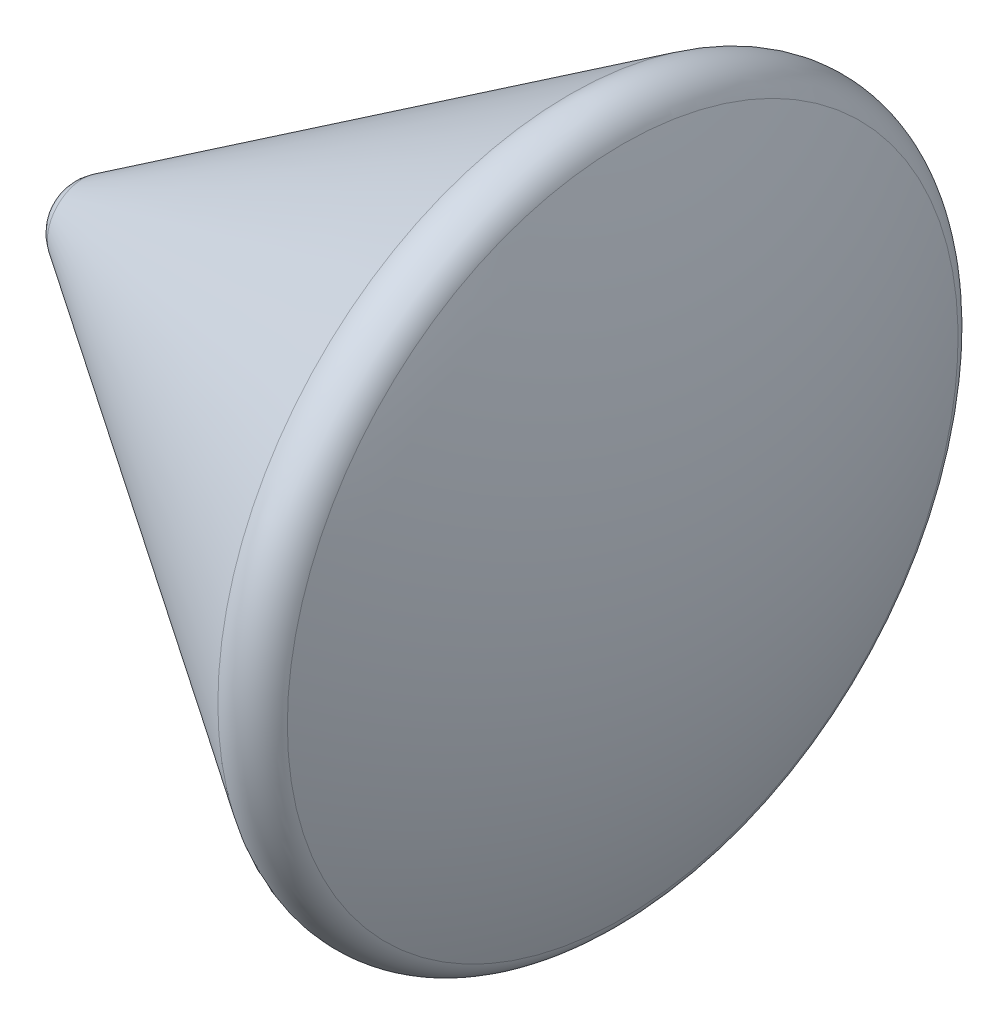
ISO-10303-21;
HEADER;
FILE_DESCRIPTION(('STEP AP214'),'2;1');
FILE_NAME('part.step','',(''),(''),'','','');
FILE_SCHEMA(('AUTOMOTIVE_DESIGN { 1 0 10303 214 1 1 1 1 }'));
ENDSEC;
DATA;
#1=APPLICATION_CONTEXT('core data for automotive mechanical design processes');
#2=APPLICATION_PROTOCOL_DEFINITION('international standard','automotive_design',2000,#1);
#3=PRODUCT_CONTEXT('',#1,'mechanical');
#4=PRODUCT('Part','Part','',(#3));
#5=PRODUCT_RELATED_PRODUCT_CATEGORY('part','',(#4));
#6=PRODUCT_DEFINITION_FORMATION('','',#4);
#7=PRODUCT_DEFINITION_CONTEXT('part definition',#1,'design');
#8=PRODUCT_DEFINITION('design','',#6,#7);
#9=PRODUCT_DEFINITION_SHAPE('','',#8);
#10=(LENGTH_UNIT() NAMED_UNIT(*) SI_UNIT(.MILLI.,.METRE.));
#11=(NAMED_UNIT(*) PLANE_ANGLE_UNIT() SI_UNIT($,.RADIAN.));
#12=(NAMED_UNIT(*) SI_UNIT($,.STERADIAN.) SOLID_ANGLE_UNIT());
#13=UNCERTAINTY_MEASURE_WITH_UNIT(LENGTH_MEASURE(1.E-05),#10,'distance_accuracy_value','');
#14=(GEOMETRIC_REPRESENTATION_CONTEXT(3) GLOBAL_UNCERTAINTY_ASSIGNED_CONTEXT((#13)) GLOBAL_UNIT_ASSIGNED_CONTEXT((#10,
#11,#12)) REPRESENTATION_CONTEXT('',''));
#15=CARTESIAN_POINT('',(0.,0.,0.));
#16=DIRECTION('',(0.,0.,1.));
#17=DIRECTION('',(1.,0.,0.));
#18=AXIS2_PLACEMENT_3D('',#15,#16,#17);
#19=CARTESIAN_POINT('',(231.,0.,0.));
#20=DIRECTION('',(-1.,0.,0.));
#21=DIRECTION('',(0.,1.,0.));
#22=AXIS2_PLACEMENT_3D('',#19,#20,#21);
#23=SPHERICAL_SURFACE('',#22,231.);
#24=CARTESIAN_POINT('',(105.18838291153,0.,0.));
#25=DIRECTION('',(-1.,0.,0.));
#26=DIRECTION('',(0.,0.,1.));
#27=AXIS2_PLACEMENT_3D('',#24,#25,#26);
#28=CIRCLE('',#27,193.732901195394);
#29=CARTESIAN_POINT('',(105.18838291153,0.,-193.732901195394));
#30=VERTEX_POINT('',#29);
#31=EDGE_CURVE('E45',#30,#30,#28,.T.);
#32=ORIENTED_EDGE('',*,*,#31,.T.);
#33=EDGE_LOOP('',(#32));
#34=FACE_BOUND('',#33,.T.);
#35=ADVANCED_FACE('F35',(#34),#23,.T.);
#36=CARTESIAN_POINT('',(-1303.,0.,0.));
#37=DIRECTION('',(-1.,0.,0.));
#38=DIRECTION('',(0.,1.,0.));
#39=AXIS2_PLACEMENT_3D('',#36,#37,#38);
#40=SPHERICAL_SURFACE('',#39,4694.);
#41=CARTESIAN_POINT('',(3025.84671646712,0.,0.));
#42=DIRECTION('',(-1.,0.,0.));
#43=DIRECTION('',(0.,0.,1.));
#44=AXIS2_PLACEMENT_3D('',#41,#42,#43);
#45=CIRCLE('',#44,1815.1369384517);
#46=CARTESIAN_POINT('',(3025.84671646712,0.,1815.1369384517));
#47=VERTEX_POINT('',#46);
#48=EDGE_CURVE('E10',#47,#47,#45,.T.);
#49=ORIENTED_EDGE('',*,*,#48,.F.);
#50=EDGE_LOOP('',(#49));
#51=FACE_BOUND('',#50,.T.);
#52=ADVANCED_FACE('F60',(#51),#40,.T.);
#53=CARTESIAN_POINT('',(2845.09384973777,0.,0.));
#54=DIRECTION('',(-1.,0.,0.));
#55=DIRECTION('',(0.,0.,1.));
#56=AXIS2_PLACEMENT_3D('',#53,#54,#55);
#57=TOROIDAL_SURFACE('',#56,1739.34511059986,196.);
#58=CARTESIAN_POINT('',(2738.34459887483,0.,0.));
#59=DIRECTION('',(-1.,0.,0.));
#60=DIRECTION('',(0.,0.,1.));
#61=AXIS2_PLACEMENT_3D('',#58,#59,#60);
#62=CIRCLE('',#61,1903.72454191717);
#63=CARTESIAN_POINT('',(2738.34459887483,0.,-1903.72454191717));
#64=VERTEX_POINT('',#63);
#65=EDGE_CURVE('E41',#64,#64,#62,.T.);
#66=ORIENTED_EDGE('',*,*,#65,.F.);
#67=EDGE_LOOP('',(#66));
#68=FACE_BOUND('',#67,.T.);
#69=ORIENTED_EDGE('',*,*,#48,.T.);
#70=EDGE_LOOP('',(#69));
#71=FACE_BOUND('',#70,.T.);
#72=ADVANCED_FACE('F55',(#68,#71),#57,.T.);
#73=CARTESIAN_POINT('',(2738.34459887483,0.,0.));
#74=DIRECTION('',(1.,0.,0.));
#75=DIRECTION('',(0.,0.,-1.));
#76=AXIS2_PLACEMENT_3D('',#73,#74,#75);
#77=CONICAL_SURFACE('',#76,1903.72454191717,0.575958653158123);
#78=CARTESIAN_POINT('',(105.18838291153,0.,-193.732901195394));
#79=CARTESIAN_POINT('',(132.617093494481,0.,-211.545314119579));
#80=CARTESIAN_POINT('',(160.045804077432,0.,-229.357727043764));
#81=CARTESIAN_POINT('',(214.903225243334,0.,-264.982552892134));
#82=CARTESIAN_POINT('',(242.331935826285,0.,-282.794965816319));
#83=CARTESIAN_POINT('',(297.189356992187,0.,-318.41979166469));
#84=CARTESIAN_POINT('',(324.618067575138,0.,-336.232204588875));
#85=CARTESIAN_POINT('',(379.47548874104,0.,-371.857030437245));
#86=CARTESIAN_POINT('',(406.904199323991,0.,-389.66944336143));
#87=CARTESIAN_POINT('',(461.761620489893,0.,-425.2942692098));
#88=CARTESIAN_POINT('',(489.190331072845,0.,-443.106682133985));
#89=CARTESIAN_POINT('',(544.047752238747,0.,-478.731507982356));
#90=CARTESIAN_POINT('',(571.476462821698,0.,-496.543920906541));
#91=CARTESIAN_POINT('',(626.3338839876,0.,-532.168746754911));
#92=CARTESIAN_POINT('',(653.762594570551,0.,-549.981159679096));
#93=CARTESIAN_POINT('',(708.620015736453,0.,-585.605985527467));
#94=CARTESIAN_POINT('',(736.048726319404,0.,-603.418398451652));
#95=CARTESIAN_POINT('',(790.906147485306,0.,-639.043224300022));
#96=CARTESIAN_POINT('',(818.334858068257,0.,-656.855637224207));
#97=CARTESIAN_POINT('',(873.192279234159,0.,-692.480463072577));
#98=CARTESIAN_POINT('',(900.62098981711,0.,-710.292875996762));
#99=CARTESIAN_POINT('',(955.478410983012,0.,-745.917701845132));
#100=CARTESIAN_POINT('',(982.907121565964,0.,-763.730114769318));
#101=CARTESIAN_POINT('',(1037.76454273187,0.,-799.354940617688));
#102=CARTESIAN_POINT('',(1065.19325331482,0.,-817.167353541873));
#103=CARTESIAN_POINT('',(1120.05067448072,0.,-852.792179390243));
#104=CARTESIAN_POINT('',(1147.47938506367,0.,-870.604592314428));
#105=CARTESIAN_POINT('',(1202.33680622957,0.,-906.229418162799));
#106=CARTESIAN_POINT('',(1229.76551681252,0.,-924.041831086984));
#107=CARTESIAN_POINT('',(1284.62293797843,0.,-959.666656935354));
#108=CARTESIAN_POINT('',(1312.05164856138,0.,-977.479069859539));
#109=CARTESIAN_POINT('',(1366.90906972728,0.,-1013.10389570791));
#110=CARTESIAN_POINT('',(1394.33778031023,0.,-1030.91630863209));
#111=CARTESIAN_POINT('',(1449.19520147613,0.,-1066.54113448046));
#112=CARTESIAN_POINT('',(1476.62391205908,0.,-1084.35354740465));
#113=CARTESIAN_POINT('',(1531.48133322498,0.,-1119.97837325302));
#114=CARTESIAN_POINT('',(1558.91004380794,0.,-1137.79078617721));
#115=CARTESIAN_POINT('',(1613.76746497384,0.,-1173.41561202558));
#116=CARTESIAN_POINT('',(1641.19617555679,0.,-1191.22802494976));
#117=CARTESIAN_POINT('',(1696.05359672269,0.,-1226.85285079813));
#118=CARTESIAN_POINT('',(1723.48230730564,0.,-1244.66526372232));
#119=CARTESIAN_POINT('',(1778.33972847154,0.,-1280.29008957069));
#120=CARTESIAN_POINT('',(1805.7684390545,0.,-1298.10250249487));
#121=CARTESIAN_POINT('',(1860.6258602204,0.,-1333.72732834324));
#122=CARTESIAN_POINT('',(1888.05457080335,0.,-1351.53974126743));
#123=CARTESIAN_POINT('',(1942.91199196925,0.,-1387.1645671158));
#124=CARTESIAN_POINT('',(1970.3407025522,0.,-1404.97698003998));
#125=CARTESIAN_POINT('',(2025.1981237181,0.,-1440.60180588835));
#126=CARTESIAN_POINT('',(2052.62683430105,0.,-1458.41421881254));
#127=CARTESIAN_POINT('',(2107.48425546696,0.,-1494.03904466091));
#128=CARTESIAN_POINT('',(2134.91296604991,0.,-1511.85145758509));
#129=CARTESIAN_POINT('',(2189.77038721581,0.,-1547.47628343346));
#130=CARTESIAN_POINT('',(2217.19909779876,0.,-1565.28869635765));
#131=CARTESIAN_POINT('',(2272.05651896466,0.,-1600.91352220602));
#132=CARTESIAN_POINT('',(2299.48522954761,0.,-1618.7259351302));
#133=CARTESIAN_POINT('',(2354.34265071352,0.,-1654.35076097857));
#134=CARTESIAN_POINT('',(2381.77136129647,0.,-1672.16317390276));
#135=CARTESIAN_POINT('',(2436.62878246237,0.,-1707.78799975113));
#136=CARTESIAN_POINT('',(2464.05749304532,0.,-1725.60041267531));
#137=CARTESIAN_POINT('',(2518.91491421122,0.,-1761.22523852368));
#138=CARTESIAN_POINT('',(2546.34362479417,0.,-1779.03765144787));
#139=CARTESIAN_POINT('',(2601.20104596008,0.,-1814.66247729624));
#140=CARTESIAN_POINT('',(2628.62975654303,0.,-1832.47489022042));
#141=CARTESIAN_POINT('',(2683.48717770893,0.,-1868.0997160688));
#142=CARTESIAN_POINT('',(2710.91588829188,0.,-1885.91212899298));
#143=CARTESIAN_POINT('',(2738.34459887483,0.,-1903.72454191717));
#144=B_SPLINE_CURVE_WITH_KNOTS('',3,(#78,#79,#80,#81,#82,#83,#84,#85,#86,#87,#88,#89,#90,#91,
#92,#93,#94,#95,#96,#97,#98,#99,#100,#101,#102,#103,#104,#105,#106,#107,#108,#109,#110,#111,
#112,#113,#114,#115,#116,#117,#118,#119,#120,#121,#122,#123,#124,#125,#126,#127,#128,#129,#130,
#131,#132,#133,#134,#135,#136,#137,#138,#139,#140,#141,#142,#143),.UNSPECIFIED.,.F.,.F.,(4,2,2,
2,2,2,2,2,2,2,2,2,2,2,2,2,2,2,2,2,2,2,2,2,2,2,2,2,2,2,2,2,4),(0.,98.1149630067946,
196.22992601359,294.344889020384,392.459852027179,490.574815033974,588.689778040769,
686.804741047564,784.919704054359,883.034667061153,981.149630067948,1079.26459307474,
1177.37955608154,1275.49451908833,1373.60948209513,1471.72444510192,1569.83940810872,
1667.95437111551,1766.06933412231,1864.1842971291,1962.2992601359,2060.41422314269,
2158.52918614949,2256.64414915628,2354.75911216308,2452.87407516987,2550.98903817667,
2649.10400118346,2747.21896419026,2845.33392719705,2943.44889020384,3041.56385321064,
3139.67881621743),.UNSPECIFIED.);
#145=EDGE_CURVE('BSEAM53',#30,#64,#144,.T.);
#146=ORIENTED_EDGE('',*,*,#31,.F.);
#147=ORIENTED_EDGE('',*,*,#65,.T.);
#148=ORIENTED_EDGE('',*,*,#145,.T.);
#149=ORIENTED_EDGE('',*,*,#145,.F.);
#150=EDGE_LOOP('',(#146,#148,#147,#149));
#151=FACE_BOUND('',#150,.T.);
#152=ADVANCED_FACE('F53',(#151),#77,.T.);
#153=CLOSED_SHELL('',(#35,#52,#72,#152));
#154=MANIFOLD_SOLID_BREP('B2',#153);
#155=ADVANCED_BREP_SHAPE_REPRESENTATION('',(#18,#154),#14);
#156=SHAPE_DEFINITION_REPRESENTATION(#9,#155);
ENDSEC;
END-ISO-10303-21;
